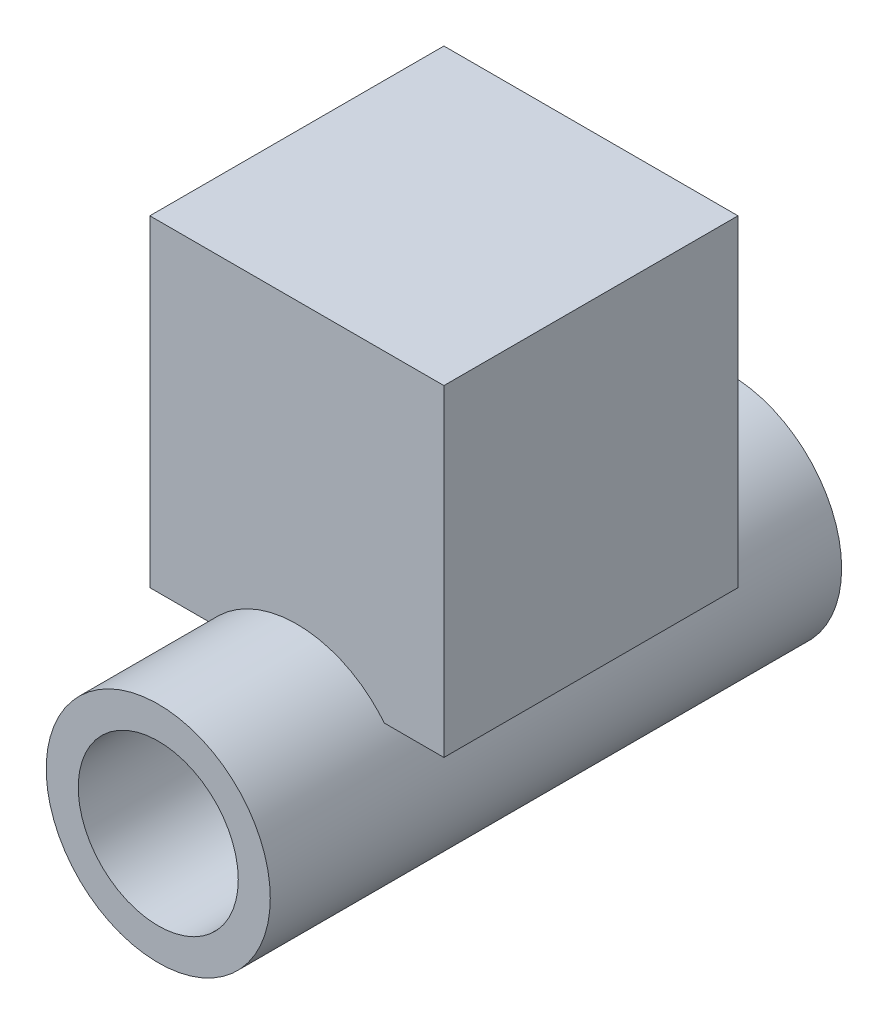
ISO-10303-21;
HEADER;
FILE_DESCRIPTION(('STEP AP214'),'2;1');
FILE_NAME('part.step','',(''),(''),'','','');
FILE_SCHEMA(('AUTOMOTIVE_DESIGN { 1 0 10303 214 1 1 1 1 }'));
ENDSEC;
DATA;
#1=APPLICATION_CONTEXT('core data for automotive mechanical design processes');
#2=APPLICATION_PROTOCOL_DEFINITION('international standard','automotive_design',2000,#1);
#3=PRODUCT_CONTEXT('',#1,'mechanical');
#4=PRODUCT('Part','Part','',(#3));
#5=PRODUCT_RELATED_PRODUCT_CATEGORY('part','',(#4));
#6=PRODUCT_DEFINITION_FORMATION('','',#4);
#7=PRODUCT_DEFINITION_CONTEXT('part definition',#1,'design');
#8=PRODUCT_DEFINITION('design','',#6,#7);
#9=PRODUCT_DEFINITION_SHAPE('','',#8);
#10=(LENGTH_UNIT() NAMED_UNIT(*) SI_UNIT(.MILLI.,.METRE.));
#11=(NAMED_UNIT(*) PLANE_ANGLE_UNIT() SI_UNIT($,.RADIAN.));
#12=(NAMED_UNIT(*) SI_UNIT($,.STERADIAN.) SOLID_ANGLE_UNIT());
#13=UNCERTAINTY_MEASURE_WITH_UNIT(LENGTH_MEASURE(1.E-05),#10,'distance_accuracy_value','');
#14=(GEOMETRIC_REPRESENTATION_CONTEXT(3) GLOBAL_UNCERTAINTY_ASSIGNED_CONTEXT((#13)) GLOBAL_UNIT_ASSIGNED_CONTEXT((#10,
#11,#12)) REPRESENTATION_CONTEXT('',''));
#15=CARTESIAN_POINT('',(0.,0.,0.));
#16=DIRECTION('',(0.,0.,1.));
#17=DIRECTION('',(1.,0.,0.));
#18=AXIS2_PLACEMENT_3D('',#15,#16,#17);
#19=CARTESIAN_POINT('',(-17.5,8.335,-51.5));
#20=DIRECTION('',(0.,0.,-1.));
#21=DIRECTION('',(-1.,0.,0.));
#22=AXIS2_PLACEMENT_3D('',#19,#20,#21);
#23=PLANE('',#22);
#24=DIRECTION('',(0.,1.,0.));
#25=VECTOR('',#24,1.);
#26=CARTESIAN_POINT('',(-17.5,8.335,-51.5));
#27=LINE('',#26,#25);
#28=CARTESIAN_POINT('',(-17.5,8.335,-51.5));
#29=VERTEX_POINT('',#28);
#30=CARTESIAN_POINT('',(-17.5,46.665,-51.5));
#31=VERTEX_POINT('',#30);
#32=EDGE_CURVE('E44',#29,#31,#27,.T.);
#33=ORIENTED_EDGE('',*,*,#32,.T.);
#34=DIRECTION('',(-1.,0.,0.));
#35=VECTOR('',#34,1.);
#36=CARTESIAN_POINT('',(-17.5,46.665,-51.5));
#37=LINE('',#36,#35);
#38=CARTESIAN_POINT('',(17.5,46.665,-51.5));
#39=VERTEX_POINT('',#38);
#40=EDGE_CURVE('E81',#39,#31,#37,.T.);
#41=ORIENTED_EDGE('',*,*,#40,.F.);
#42=DIRECTION('',(0.,1.,0.));
#43=VECTOR('',#42,1.);
#44=CARTESIAN_POINT('',(17.5,8.335,-51.5));
#45=LINE('',#44,#43);
#46=CARTESIAN_POINT('',(17.5,8.335,-51.5));
#47=VERTEX_POINT('',#46);
#48=EDGE_CURVE('E12',#47,#39,#45,.T.);
#49=ORIENTED_EDGE('',*,*,#48,.F.);
#50=DIRECTION('',(-1.,0.,0.));
#51=VECTOR('',#50,1.);
#52=CARTESIAN_POINT('',(-17.5,8.335,-51.5));
#53=LINE('',#52,#51);
#54=EDGE_CURVE('E82',#47,#29,#53,.T.);
#55=ORIENTED_EDGE('',*,*,#54,.T.);
#56=EDGE_LOOP('',(#33,#41,#49,#55));
#57=FACE_BOUND('',#56,.T.);
#58=ADVANCED_FACE('F41',(#57),#23,.T.);
#59=CARTESIAN_POINT('',(17.5,8.335,-16.5));
#60=DIRECTION('',(1.,0.,0.));
#61=DIRECTION('',(0.,1.,0.));
#62=AXIS2_PLACEMENT_3D('',#59,#60,#61);
#63=PLANE('',#62);
#64=ORIENTED_EDGE('',*,*,#48,.T.);
#65=DIRECTION('',(0.,0.,-1.));
#66=VECTOR('',#65,1.);
#67=CARTESIAN_POINT('',(17.5,46.665,-16.5));
#68=LINE('',#67,#66);
#69=CARTESIAN_POINT('',(17.5,46.665,-16.5));
#70=VERTEX_POINT('',#69);
#71=EDGE_CURVE('E98',#70,#39,#68,.T.);
#72=ORIENTED_EDGE('',*,*,#71,.F.);
#73=DIRECTION('',(0.,1.,0.));
#74=VECTOR('',#73,1.);
#75=CARTESIAN_POINT('',(17.5,8.335,-16.5));
#76=LINE('',#75,#74);
#77=CARTESIAN_POINT('',(17.5,8.335,-16.5));
#78=VERTEX_POINT('',#77);
#79=EDGE_CURVE('E49',#78,#70,#76,.T.);
#80=ORIENTED_EDGE('',*,*,#79,.F.);
#81=DIRECTION('',(0.,0.,-1.));
#82=VECTOR('',#81,1.);
#83=CARTESIAN_POINT('',(17.5,8.335,-16.5));
#84=LINE('',#83,#82);
#85=EDGE_CURVE('E87',#78,#47,#84,.T.);
#86=ORIENTED_EDGE('',*,*,#85,.T.);
#87=EDGE_LOOP('',(#64,#72,#80,#86));
#88=FACE_BOUND('',#87,.T.);
#89=ADVANCED_FACE('F113',(#88),#63,.T.);
#90=CARTESIAN_POINT('',(-17.5,8.335,-16.5));
#91=DIRECTION('',(0.,0.,1.));
#92=DIRECTION('',(1.,0.,0.));
#93=AXIS2_PLACEMENT_3D('',#90,#91,#92);
#94=PLANE('',#93);
#95=ORIENTED_EDGE('',*,*,#79,.T.);
#96=DIRECTION('',(1.,0.,0.));
#97=VECTOR('',#96,1.);
#98=CARTESIAN_POINT('',(-17.5,46.665,-16.5));
#99=LINE('',#98,#97);
#100=CARTESIAN_POINT('',(-17.5,46.665,-16.5));
#101=VERTEX_POINT('',#100);
#102=EDGE_CURVE('E94',#101,#70,#99,.T.);
#103=ORIENTED_EDGE('',*,*,#102,.F.);
#104=DIRECTION('',(0.,1.,0.));
#105=VECTOR('',#104,1.);
#106=CARTESIAN_POINT('',(-17.5,8.335,-16.5));
#107=LINE('',#106,#105);
#108=CARTESIAN_POINT('',(-17.5,8.335,-16.5));
#109=VERTEX_POINT('',#108);
#110=EDGE_CURVE('E86',#109,#101,#107,.T.);
#111=ORIENTED_EDGE('',*,*,#110,.F.);
#112=DIRECTION('',(1.,0.,0.));
#113=VECTOR('',#112,1.);
#114=CARTESIAN_POINT('',(-17.5,8.335,-16.5));
#115=LINE('',#114,#113);
#116=EDGE_CURVE('E106',#109,#78,#115,.T.);
#117=ORIENTED_EDGE('',*,*,#116,.T.);
#118=EDGE_LOOP('',(#95,#103,#111,#117));
#119=FACE_BOUND('',#118,.T.);
#120=ADVANCED_FACE('F110',(#119),#94,.T.);
#121=CARTESIAN_POINT('',(-17.5,8.335,-16.5));
#122=DIRECTION('',(-1.,0.,0.));
#123=DIRECTION('',(0.,0.,1.));
#124=AXIS2_PLACEMENT_3D('',#121,#122,#123);
#125=PLANE('',#124);
#126=ORIENTED_EDGE('',*,*,#110,.T.);
#127=DIRECTION('',(0.,0.,1.));
#128=VECTOR('',#127,1.);
#129=CARTESIAN_POINT('',(-17.5,46.665,-16.5));
#130=LINE('',#129,#128);
#131=EDGE_CURVE('E89',#31,#101,#130,.T.);
#132=ORIENTED_EDGE('',*,*,#131,.F.);
#133=ORIENTED_EDGE('',*,*,#32,.F.);
#134=DIRECTION('',(0.,0.,1.));
#135=VECTOR('',#134,1.);
#136=CARTESIAN_POINT('',(-17.5,8.335,-16.5));
#137=LINE('',#136,#135);
#138=EDGE_CURVE('E104',#29,#109,#137,.T.);
#139=ORIENTED_EDGE('',*,*,#138,.T.);
#140=EDGE_LOOP('',(#126,#132,#133,#139));
#141=FACE_BOUND('',#140,.T.);
#142=ADVANCED_FACE('F90',(#141),#125,.T.);
#143=CARTESIAN_POINT('',(0.,8.335,0.));
#144=DIRECTION('',(0.,1.,0.));
#145=DIRECTION('',(-1.,0.,0.));
#146=AXIS2_PLACEMENT_3D('',#143,#144,#145);
#147=PLANE('',#146);
#148=ORIENTED_EDGE('',*,*,#54,.F.);
#149=ORIENTED_EDGE('',*,*,#85,.F.);
#150=ORIENTED_EDGE('',*,*,#116,.F.);
#151=ORIENTED_EDGE('',*,*,#138,.F.);
#152=EDGE_LOOP('',(#148,#149,#150,#151));
#153=FACE_BOUND('',#152,.T.);
#154=ADVANCED_FACE('F115',(#153),#147,.F.);
#155=CARTESIAN_POINT('',(0.,46.665,0.));
#156=DIRECTION('',(0.,1.,0.));
#157=DIRECTION('',(-1.,0.,0.));
#158=AXIS2_PLACEMENT_3D('',#155,#156,#157);
#159=PLANE('',#158);
#160=ORIENTED_EDGE('',*,*,#40,.T.);
#161=ORIENTED_EDGE('',*,*,#131,.T.);
#162=ORIENTED_EDGE('',*,*,#102,.T.);
#163=ORIENTED_EDGE('',*,*,#71,.T.);
#164=EDGE_LOOP('',(#160,#161,#162,#163));
#165=FACE_BOUND('',#164,.T.);
#166=ADVANCED_FACE('F97',(#165),#159,.T.);
#167=CLOSED_SHELL('',(#58,#89,#120,#142,#154,#166));
#168=MANIFOLD_SOLID_BREP('B2',#167);
#169=CARTESIAN_POINT('',(0.,0.,-68.));
#170=DIRECTION('',(0.,0.,1.));
#171=DIRECTION('',(1.,0.,0.));
#172=AXIS2_PLACEMENT_3D('',#169,#170,#171);
#173=CYLINDRICAL_SURFACE('',#172,13.335);
#174=CARTESIAN_POINT('',(0.,0.,-68.));
#175=DIRECTION('',(0.,0.,1.));
#176=DIRECTION('',(1.,0.,0.));
#177=AXIS2_PLACEMENT_3D('',#174,#175,#176);
#178=CIRCLE('',#177,13.335);
#179=CARTESIAN_POINT('',(13.335,0.,-68.));
#180=VERTEX_POINT('',#179);
#181=EDGE_CURVE('E40',#180,#180,#178,.T.);
#182=ORIENTED_EDGE('',*,*,#181,.T.);
#183=EDGE_LOOP('',(#182));
#184=FACE_BOUND('',#183,.T.);
#185=CARTESIAN_POINT('',(0.,0.,0.));
#186=DIRECTION('',(0.,0.,1.));
#187=DIRECTION('',(1.,0.,0.));
#188=AXIS2_PLACEMENT_3D('',#185,#186,#187);
#189=CIRCLE('',#188,13.335);
#190=CARTESIAN_POINT('',(13.335,0.,0.));
#191=VERTEX_POINT('',#190);
#192=EDGE_CURVE('E167',#191,#191,#189,.T.);
#193=ORIENTED_EDGE('',*,*,#192,.F.);
#194=EDGE_LOOP('',(#193));
#195=FACE_BOUND('',#194,.T.);
#196=ADVANCED_FACE('F164',(#184,#195),#173,.T.);
#197=CARTESIAN_POINT('',(0.,0.,-68.));
#198=DIRECTION('',(0.,0.,1.));
#199=DIRECTION('',(1.,0.,0.));
#200=AXIS2_PLACEMENT_3D('',#197,#198,#199);
#201=PLANE('',#200);
#202=CARTESIAN_POINT('',(0.,0.,-68.));
#203=DIRECTION('',(0.,0.,1.));
#204=DIRECTION('',(1.,0.,0.));
#205=AXIS2_PLACEMENT_3D('',#202,#203,#204);
#206=CIRCLE('',#205,9.525);
#207=CARTESIAN_POINT('',(9.525,0.,-68.));
#208=VERTEX_POINT('',#207);
#209=EDGE_CURVE('E174',#208,#208,#206,.T.);
#210=ORIENTED_EDGE('',*,*,#209,.T.);
#211=EDGE_LOOP('',(#210));
#212=FACE_BOUND('',#211,.T.);
#213=ORIENTED_EDGE('',*,*,#181,.F.);
#214=EDGE_LOOP('',(#213));
#215=FACE_BOUND('',#214,.T.);
#216=ADVANCED_FACE('F182',(#212,#215),#201,.F.);
#217=CARTESIAN_POINT('',(0.,0.,0.));
#218=DIRECTION('',(0.,0.,1.));
#219=DIRECTION('',(1.,0.,0.));
#220=AXIS2_PLACEMENT_3D('',#217,#218,#219);
#221=PLANE('',#220);
#222=CARTESIAN_POINT('',(0.,0.,0.));
#223=DIRECTION('',(0.,0.,1.));
#224=DIRECTION('',(1.,0.,0.));
#225=AXIS2_PLACEMENT_3D('',#222,#223,#224);
#226=CIRCLE('',#225,9.525);
#227=CARTESIAN_POINT('',(9.525,0.,0.));
#228=VERTEX_POINT('',#227);
#229=EDGE_CURVE('E176',#228,#228,#226,.T.);
#230=ORIENTED_EDGE('',*,*,#229,.F.);
#231=EDGE_LOOP('',(#230));
#232=FACE_BOUND('',#231,.T.);
#233=ORIENTED_EDGE('',*,*,#192,.T.);
#234=EDGE_LOOP('',(#233));
#235=FACE_BOUND('',#234,.T.);
#236=ADVANCED_FACE('F188',(#232,#235),#221,.T.);
#237=CARTESIAN_POINT('',(0.,0.,-68.));
#238=DIRECTION('',(0.,0.,1.));
#239=DIRECTION('',(1.,0.,0.));
#240=AXIS2_PLACEMENT_3D('',#237,#238,#239);
#241=CYLINDRICAL_SURFACE('',#240,9.525);
#242=ORIENTED_EDGE('',*,*,#209,.F.);
#243=EDGE_LOOP('',(#242));
#244=FACE_BOUND('',#243,.T.);
#245=ORIENTED_EDGE('',*,*,#229,.T.);
#246=EDGE_LOOP('',(#245));
#247=FACE_BOUND('',#246,.T.);
#248=ADVANCED_FACE('F185',(#244,#247),#241,.F.);
#249=CLOSED_SHELL('',(#196,#216,#236,#248));
#250=MANIFOLD_SOLID_BREP('B6',#249);
#251=ADVANCED_BREP_SHAPE_REPRESENTATION('',(#18,#168,#250),#14);
#252=SHAPE_DEFINITION_REPRESENTATION(#9,#251);
ENDSEC;
END-ISO-10303-21;
